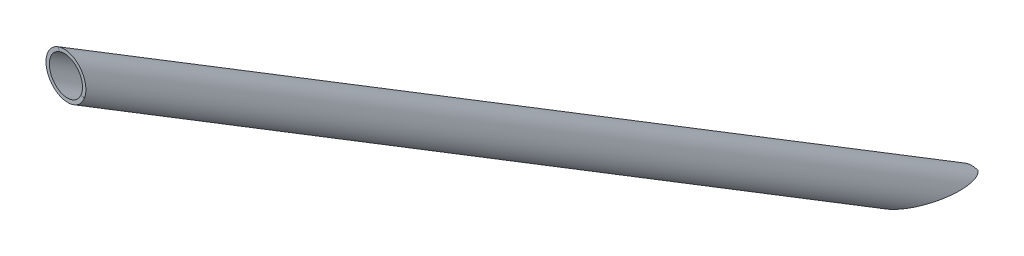
ISO-10303-21;
HEADER;
FILE_DESCRIPTION(('STEP AP214'),'2;1');
FILE_NAME('part.step','',(''),(''),'','','');
FILE_SCHEMA(('AUTOMOTIVE_DESIGN { 1 0 10303 214 1 1 1 1 }'));
ENDSEC;
DATA;
#1=APPLICATION_CONTEXT('core data for automotive mechanical design processes');
#2=APPLICATION_PROTOCOL_DEFINITION('international standard','automotive_design',2000,#1);
#3=PRODUCT_CONTEXT('',#1,'mechanical');
#4=PRODUCT('Part','Part','',(#3));
#5=PRODUCT_RELATED_PRODUCT_CATEGORY('part','',(#4));
#6=PRODUCT_DEFINITION_FORMATION('','',#4);
#7=PRODUCT_DEFINITION_CONTEXT('part definition',#1,'design');
#8=PRODUCT_DEFINITION('design','',#6,#7);
#9=PRODUCT_DEFINITION_SHAPE('','',#8);
#10=(LENGTH_UNIT() NAMED_UNIT(*) SI_UNIT(.MILLI.,.METRE.));
#11=(NAMED_UNIT(*) PLANE_ANGLE_UNIT() SI_UNIT($,.RADIAN.));
#12=(NAMED_UNIT(*) SI_UNIT($,.STERADIAN.) SOLID_ANGLE_UNIT());
#13=UNCERTAINTY_MEASURE_WITH_UNIT(LENGTH_MEASURE(1.E-05),#10,'distance_accuracy_value','');
#14=(GEOMETRIC_REPRESENTATION_CONTEXT(3) GLOBAL_UNCERTAINTY_ASSIGNED_CONTEXT((#13)) GLOBAL_UNIT_ASSIGNED_CONTEXT((#10,
#11,#12)) REPRESENTATION_CONTEXT('',''));
#15=CARTESIAN_POINT('',(0.,0.,0.));
#16=DIRECTION('',(0.,0.,1.));
#17=DIRECTION('',(1.,0.,0.));
#18=AXIS2_PLACEMENT_3D('',#15,#16,#17);
#19=CARTESIAN_POINT('',(-150.,0.,-825.));
#20=DIRECTION('',(-0.173785333909047,0.463427557090794,0.868926669545238));
#21=DIRECTION('',(0.,-0.882352941176471,0.470588235294118));
#22=AXIS2_PLACEMENT_3D('',#19,#20,#21);
#23=CYLINDRICAL_SURFACE('',#22,9.49999999999999);
#24=CARTESIAN_POINT('',(-160.,26.6666666666674,-774.999999999999));
#25=DIRECTION('',(1.,0.,0.));
#26=DIRECTION('',(0.,0.470588235294118,0.882352941176471));
#27=AXIS2_PLACEMENT_3D('',#24,#25,#26);
#28=ELLIPSE('',#27,54.6651422551682,9.49999999999999);
#29=CARTESIAN_POINT('',(-160.,10.,-787.277183560052));
#30=VERTEX_POINT('',#29);
#31=CARTESIAN_POINT('',(-160.,10.,-817.517336987893));
#32=VERTEX_POINT('',#31);
#33=EDGE_CURVE('E115',#30,#32,#28,.T.);
#34=ORIENTED_EDGE('',*,*,#33,.F.);
#35=CARTESIAN_POINT('',(-153.75,10.,-806.25));
#36=DIRECTION('',(0.,-1.,0.));
#37=DIRECTION('',(-0.196116135138184,0.,0.98058067569092));
#38=AXIS2_PLACEMENT_3D('',#35,#36,#37);
#39=ELLIPSE('',#38,20.4994283456881,9.49999999999999);
#40=CARTESIAN_POINT('',(-147.853219182835,10.,-825.504602960222));
#41=VERTEX_POINT('',#40);
#42=EDGE_CURVE('E118',#41,#30,#39,.T.);
#43=ORIENTED_EDGE('',*,*,#42,.F.);
#44=CARTESIAN_POINT('',(-150.,-2.60104418448216E-13,-825.));
#45=DIRECTION('',(0.0197141066523154,0.0461644942318043,0.998739302055958));
#46=DIRECTION('',(-0.412111349099455,0.910500714966002,-0.0339512001235188));
#47=AXIS2_PLACEMENT_3D('',#44,#45,#46);
#48=ELLIPSE('',#47,10.7247795684855,9.49999999999999);
#49=CARTESIAN_POINT('',(-153.842522857187,10.,-825.386380145553));
#50=VERTEX_POINT('',#49);
#51=EDGE_CURVE('E125',#50,#41,#48,.F.);
#52=ORIENTED_EDGE('',*,*,#51,.F.);
#53=EDGE_CURVE('E102',#32,#50,#39,.T.);
#54=ORIENTED_EDGE('',*,*,#53,.F.);
#55=EDGE_LOOP('',(#34,#43,#52,#54));
#56=FACE_BOUND('',#55,.T.);
#57=CARTESIAN_POINT('',(-222.999905812775,194.666415500733,-460.000470936125));
#58=DIRECTION('',(-0.00908676337012319,-0.00340753626379591,0.999952908605234));
#59=DIRECTION('',(-0.335122678085325,0.942174486654077,0.000165321039572089));
#60=AXIS2_PLACEMENT_3D('',#57,#58,#59);
#61=ELLIPSE('',#60,10.9335433268386,9.49999999999999);
#62=CARTESIAN_POINT('',(-226.793357611978,204.920484745495,-460.));
#63=VERTEX_POINT('',#62);
#64=CARTESIAN_POINT('',(-213.932152799532,190.035278912597,-459.933852038884));
#65=VERTEX_POINT('',#64);
#66=EDGE_CURVE('E49',#63,#65,#61,.T.);
#67=ORIENTED_EDGE('',*,*,#66,.F.);
#68=CARTESIAN_POINT('',(-223.,194.666666666667,-460.));
#69=DIRECTION('',(0.,0.,1.));
#70=DIRECTION('',(-0.351123441588391,0.936329177569045,0.));
#71=AXIS2_PLACEMENT_3D('',#68,#69,#70);
#72=ELLIPSE('',#71,10.9330284510336,9.49999999999999);
#73=CARTESIAN_POINT('',(-213.918923207309,190.,-460.));
#74=VERTEX_POINT('',#73);
#75=EDGE_CURVE('E100',#74,#63,#72,.T.);
#76=ORIENTED_EDGE('',*,*,#75,.F.);
#77=DIRECTION('',(0.173785333909047,-0.463427557090794,-0.868926669545238));
#78=VECTOR('',#77,1.);
#79=CARTESIAN_POINT('',(-2542.16686496037,6398.66117800817,11181.2397087653));
#80=LINE('',#79,#78);
#81=EDGE_CURVE('E127',#65,#74,#80,.T.);
#82=ORIENTED_EDGE('',*,*,#81,.F.);
#83=EDGE_LOOP('',(#67,#76,#82));
#84=FACE_BOUND('',#83,.T.);
#85=ADVANCED_FACE('F39',(#56,#84),#23,.T.);
#86=CARTESIAN_POINT('',(-2103.24794175306,6398.66117800817,11181.2397087653));
#87=DIRECTION('',(0.,-0.882352941176471,0.470588235294118));
#88=DIRECTION('',(0.,-0.470588235294118,-0.882352941176471));
#89=AXIS2_PLACEMENT_3D('',#86,#87,#88);
#90=PLANE('',#89);
#91=DIRECTION('',(-0.999946778140837,-0.00485506787219542,-0.00910325226036641));
#92=VECTOR('',#91,1.);
#93=CARTESIAN_POINT('',(-1966.93824598116,181.523862356414,-475.892758081725));
#94=LINE('',#93,#92);
#95=CARTESIAN_POINT('',(-215.776122994274,190.026325835647,-459.950639058164));
#96=VERTEX_POINT('',#95);
#97=EDGE_CURVE('E11',#65,#96,#94,.T.);
#98=ORIENTED_EDGE('',*,*,#97,.F.);
#99=ORIENTED_EDGE('',*,*,#81,.T.);
#100=DIRECTION('',(-1.,0.,0.));
#101=VECTOR('',#100,1.);
#102=CARTESIAN_POINT('',(225.,190.,-460.));
#103=LINE('',#102,#101);
#104=CARTESIAN_POINT('',(-215.766250805907,190.,-460.));
#105=VERTEX_POINT('',#104);
#106=EDGE_CURVE('E112',#74,#105,#103,.T.);
#107=ORIENTED_EDGE('',*,*,#106,.T.);
#108=DIRECTION('',(0.173785333909047,-0.463427557090794,-0.868926669545238));
#109=VECTOR('',#108,1.);
#110=CARTESIAN_POINT('',(-2544.01419255897,6398.66117800817,11181.2397087653));
#111=LINE('',#110,#109);
#112=EDGE_CURVE('E43',#96,#105,#111,.T.);
#113=ORIENTED_EDGE('',*,*,#112,.F.);
#114=EDGE_LOOP('',(#98,#99,#107,#113));
#115=FACE_BOUND('',#114,.T.);
#116=ADVANCED_FACE('F150',(#115),#90,.F.);
#117=CARTESIAN_POINT('',(-150.,0.,-825.));
#118=DIRECTION('',(-0.173785333909047,0.463427557090794,0.868926669545238));
#119=DIRECTION('',(0.,-0.882352941176471,0.470588235294118));
#120=AXIS2_PLACEMENT_3D('',#117,#118,#119);
#121=CYLINDRICAL_SURFACE('',#120,7.90000000000002);
#122=CARTESIAN_POINT('',(-153.75,10.,-806.25));
#123=DIRECTION('',(0.,-1.,0.));
#124=DIRECTION('',(-0.196116135138184,0.,0.98058067569092));
#125=AXIS2_PLACEMENT_3D('',#122,#123,#124);
#126=ELLIPSE('',#125,17.0468930453617,7.90000000000002);
#127=CARTESIAN_POINT('',(-160.,10.,-813.119596803702));
#128=VERTEX_POINT('',#127);
#129=CARTESIAN_POINT('',(-160.,10.,-791.674923744243));
#130=VERTEX_POINT('',#129);
#131=EDGE_CURVE('E108',#128,#130,#126,.T.);
#132=ORIENTED_EDGE('',*,*,#131,.T.);
#133=CARTESIAN_POINT('',(-160.,26.6666666666674,-774.999999999999));
#134=DIRECTION('',(1.,0.,0.));
#135=DIRECTION('',(0.,0.470588235294118,0.882352941176471));
#136=AXIS2_PLACEMENT_3D('',#133,#134,#135);
#137=ELLIPSE('',#136,45.4583814542979,7.90000000000002);
#138=EDGE_CURVE('E105',#130,#128,#137,.T.);
#139=ORIENTED_EDGE('',*,*,#138,.T.);
#140=EDGE_LOOP('',(#132,#139));
#141=FACE_BOUND('',#140,.T.);
#142=CARTESIAN_POINT('',(-223.,194.666666666667,-460.));
#143=DIRECTION('',(0.,0.,1.));
#144=DIRECTION('',(-0.351123441588391,0.936329177569045,0.));
#145=AXIS2_PLACEMENT_3D('',#142,#143,#144);
#146=ELLIPSE('',#145,9.09167629085958,7.90000000000002);
#147=CARTESIAN_POINT('',(-226.14680556175,203.196345944885,-460.));
#148=VERTEX_POINT('',#147);
#149=EDGE_CURVE('E92',#105,#148,#146,.T.);
#150=ORIENTED_EDGE('',*,*,#149,.T.);
#151=CARTESIAN_POINT('',(-222.999905812775,194.666415500733,-460.000470936125));
#152=DIRECTION('',(-0.00908676337012319,-0.00340753626379591,0.999952908605234));
#153=DIRECTION('',(-0.335122678085325,0.942174486654077,0.000165321039572089));
#154=AXIS2_PLACEMENT_3D('',#151,#152,#153);
#155=ELLIPSE('',#154,9.09210445073952,7.90000000000002);
#156=EDGE_CURVE('E89',#148,#96,#155,.T.);
#157=ORIENTED_EDGE('',*,*,#156,.T.);
#158=ORIENTED_EDGE('',*,*,#112,.T.);
#159=EDGE_LOOP('',(#150,#157,#158));
#160=FACE_BOUND('',#159,.T.);
#161=ADVANCED_FACE('F104',(#141,#160),#121,.F.);
#162=CARTESIAN_POINT('',(225.,190.,-460.));
#163=DIRECTION('',(0.,0.,1.));
#164=DIRECTION('',(1.,0.,0.));
#165=AXIS2_PLACEMENT_3D('',#162,#163,#164);
#166=PLANE('',#165);
#167=ORIENTED_EDGE('',*,*,#75,.T.);
#168=DIRECTION('',(0.351123441588366,-0.936329177569054,0.));
#169=VECTOR('',#168,1.);
#170=CARTESIAN_POINT('',(-166.187441825692,43.3047093153777,-460.));
#171=LINE('',#170,#169);
#172=EDGE_CURVE('E86',#63,#148,#171,.T.);
#173=ORIENTED_EDGE('',*,*,#172,.T.);
#174=ORIENTED_EDGE('',*,*,#149,.F.);
#175=ORIENTED_EDGE('',*,*,#106,.F.);
#176=EDGE_LOOP('',(#167,#173,#174,#175));
#177=FACE_BOUND('',#176,.T.);
#178=ADVANCED_FACE('F96',(#177),#166,.T.);
#179=CARTESIAN_POINT('',(-160.,10.,-825.));
#180=DIRECTION('',(0.,-1.,0.));
#181=DIRECTION('',(0.,0.,-1.));
#182=AXIS2_PLACEMENT_3D('',#179,#180,#181);
#183=PLANE('',#182);
#184=ORIENTED_EDGE('',*,*,#53,.T.);
#185=CARTESIAN_POINT('',(-155.468750000001,10.,-848.593750000001));
#186=DIRECTION('',(0.,-1.,0.));
#187=DIRECTION('',(0.225801752353741,0.,0.974173274440425));
#188=AXIS2_PLACEMENT_3D('',#185,#186,#187);
#189=ELLIPSE('',#188,24.8923978299914,9.49999999999999);
#190=EDGE_CURVE('E120',#50,#41,#189,.F.);
#191=ORIENTED_EDGE('',*,*,#190,.T.);
#192=ORIENTED_EDGE('',*,*,#42,.T.);
#193=DIRECTION('',(0.,0.,1.));
#194=VECTOR('',#193,1.);
#195=CARTESIAN_POINT('',(-160.,10.,-825.));
#196=LINE('',#195,#194);
#197=EDGE_CURVE('E123',#130,#30,#196,.T.);
#198=ORIENTED_EDGE('',*,*,#197,.F.);
#199=ORIENTED_EDGE('',*,*,#131,.F.);
#200=EDGE_CURVE('E117',#32,#128,#196,.T.);
#201=ORIENTED_EDGE('',*,*,#200,.F.);
#202=EDGE_LOOP('',(#184,#191,#192,#198,#199,#201));
#203=FACE_BOUND('',#202,.T.);
#204=ADVANCED_FACE('F141',(#203),#183,.T.);
#205=CARTESIAN_POINT('',(-160.,-10.,-825.));
#206=DIRECTION('',(1.,0.,0.));
#207=DIRECTION('',(0.,0.,-1.));
#208=AXIS2_PLACEMENT_3D('',#205,#206,#207);
#209=PLANE('',#208);
#210=ORIENTED_EDGE('',*,*,#33,.T.);
#211=ORIENTED_EDGE('',*,*,#200,.T.);
#212=ORIENTED_EDGE('',*,*,#138,.F.);
#213=ORIENTED_EDGE('',*,*,#197,.T.);
#214=EDGE_LOOP('',(#210,#211,#212,#213));
#215=FACE_BOUND('',#214,.T.);
#216=ADVANCED_FACE('F147',(#215),#209,.T.);
#217=CARTESIAN_POINT('',(-325.,320.,-1580.));
#218=DIRECTION('',(0.208710809439999,-0.381642622975999,0.900438063583998));
#219=DIRECTION('',(0.,-0.920714591276893,-0.390236647958419));
#220=AXIS2_PLACEMENT_3D('',#217,#218,#219);
#221=CYLINDRICAL_SURFACE('',#220,9.49999999999999);
#222=ORIENTED_EDGE('',*,*,#51,.T.);
#223=ORIENTED_EDGE('',*,*,#190,.F.);
#224=EDGE_LOOP('',(#222,#223));
#225=FACE_BOUND('',#224,.T.);
#226=ADVANCED_FACE('F135',(#225),#221,.F.);
#227=CARTESIAN_POINT('',(-215.546281521078,203.545144429596,-459.902482410718));
#228=DIRECTION('',(-0.00908676337012319,-0.00340753626379591,0.999952908605234));
#229=DIRECTION('',(0.999958714034088,0.,0.00908681612516576));
#230=AXIS2_PLACEMENT_3D('',#227,#228,#229);
#231=PLANE('',#230);
#232=ORIENTED_EDGE('',*,*,#156,.F.);
#233=ORIENTED_EDGE('',*,*,#172,.F.);
#234=ORIENTED_EDGE('',*,*,#66,.T.);
#235=ORIENTED_EDGE('',*,*,#97,.T.);
#236=EDGE_LOOP('',(#232,#233,#234,#235));
#237=FACE_BOUND('',#236,.T.);
#238=ADVANCED_FACE('F41',(#237),#231,.T.);
#239=CLOSED_SHELL('',(#85,#116,#161,#178,#204,#216,#226,#238));
#240=MANIFOLD_SOLID_BREP('B2',#239);
#241=ADVANCED_BREP_SHAPE_REPRESENTATION('',(#18,#240),#14);
#242=SHAPE_DEFINITION_REPRESENTATION(#9,#241);
ENDSEC;
END-ISO-10303-21;
